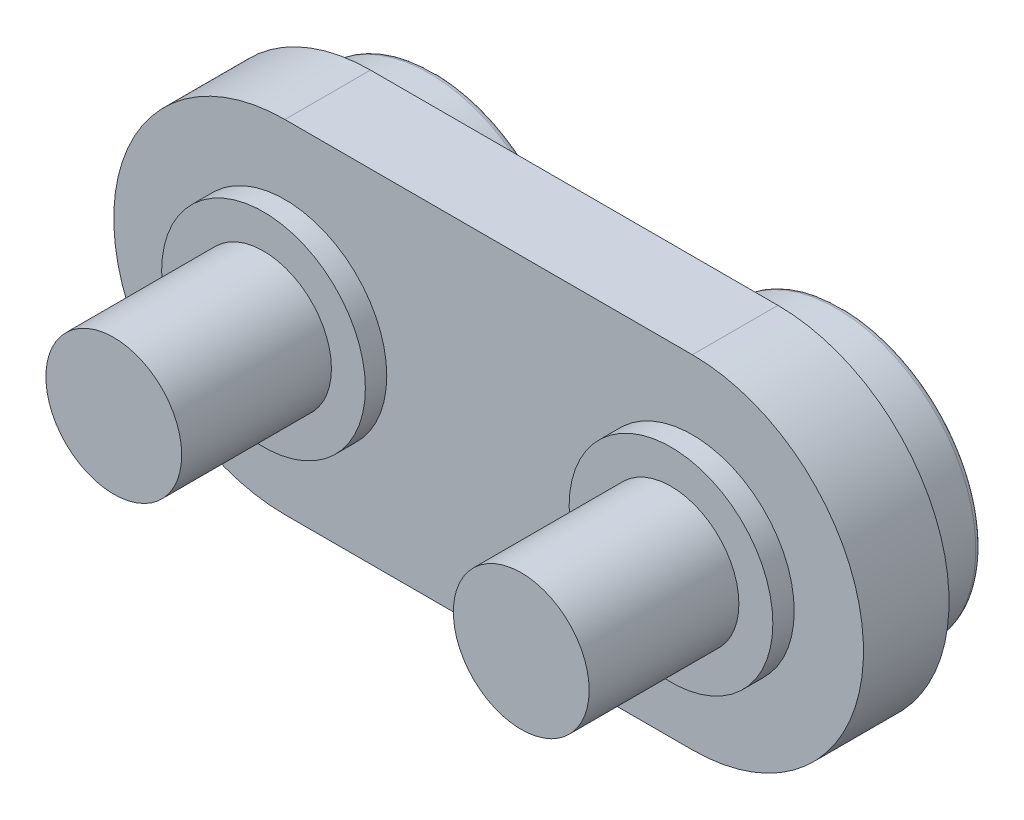
ISO-10303-21;
HEADER;
FILE_DESCRIPTION(('STEP AP214'),'2;1');
FILE_NAME('part.step','',(''),(''),'','','');
FILE_SCHEMA(('AUTOMOTIVE_DESIGN { 1 0 10303 214 1 1 1 1 }'));
ENDSEC;
DATA;
#1=APPLICATION_CONTEXT('core data for automotive mechanical design processes');
#2=APPLICATION_PROTOCOL_DEFINITION('international standard','automotive_design',2000,#1);
#3=PRODUCT_CONTEXT('',#1,'mechanical');
#4=PRODUCT('Part','Part','',(#3));
#5=PRODUCT_RELATED_PRODUCT_CATEGORY('part','',(#4));
#6=PRODUCT_DEFINITION_FORMATION('','',#4);
#7=PRODUCT_DEFINITION_CONTEXT('part definition',#1,'design');
#8=PRODUCT_DEFINITION('design','',#6,#7);
#9=PRODUCT_DEFINITION_SHAPE('','',#8);
#10=(LENGTH_UNIT() NAMED_UNIT(*) SI_UNIT(.MILLI.,.METRE.));
#11=(NAMED_UNIT(*) PLANE_ANGLE_UNIT() SI_UNIT($,.RADIAN.));
#12=(NAMED_UNIT(*) SI_UNIT($,.STERADIAN.) SOLID_ANGLE_UNIT());
#13=UNCERTAINTY_MEASURE_WITH_UNIT(LENGTH_MEASURE(1.E-05),#10,'distance_accuracy_value','');
#14=(GEOMETRIC_REPRESENTATION_CONTEXT(3) GLOBAL_UNCERTAINTY_ASSIGNED_CONTEXT((#13)) GLOBAL_UNIT_ASSIGNED_CONTEXT((#10,
#11,#12)) REPRESENTATION_CONTEXT('',''));
#15=CARTESIAN_POINT('',(0.,0.,0.));
#16=DIRECTION('',(0.,0.,1.));
#17=DIRECTION('',(1.,0.,0.));
#18=AXIS2_PLACEMENT_3D('',#15,#16,#17);
#19=CARTESIAN_POINT('',(9.525,0.,12.));
#20=DIRECTION('',(0.,0.,-1.));
#21=DIRECTION('',(-1.,0.,0.));
#22=AXIS2_PLACEMENT_3D('',#19,#20,#21);
#23=CYLINDRICAL_SURFACE('',#22,3.175);
#24=CARTESIAN_POINT('',(9.525,0.,12.));
#25=DIRECTION('',(0.,0.,1.));
#26=DIRECTION('',(1.,0.,0.));
#27=AXIS2_PLACEMENT_3D('',#24,#25,#26);
#28=CIRCLE('',#27,3.175);
#29=CARTESIAN_POINT('',(12.7,0.,12.));
#30=VERTEX_POINT('',#29);
#31=EDGE_CURVE('E11',#30,#30,#28,.T.);
#32=ORIENTED_EDGE('',*,*,#31,.F.);
#33=EDGE_LOOP('',(#32));
#34=FACE_BOUND('',#33,.T.);
#35=CARTESIAN_POINT('',(9.525,0.,5.));
#36=DIRECTION('',(0.,0.,1.));
#37=DIRECTION('',(1.,0.,0.));
#38=AXIS2_PLACEMENT_3D('',#35,#36,#37);
#39=CIRCLE('',#38,3.175);
#40=CARTESIAN_POINT('',(12.7,0.,5.));
#41=VERTEX_POINT('',#40);
#42=EDGE_CURVE('E46',#41,#41,#39,.T.);
#43=ORIENTED_EDGE('',*,*,#42,.T.);
#44=EDGE_LOOP('',(#43));
#45=FACE_BOUND('',#44,.T.);
#46=ADVANCED_FACE('F43',(#34,#45),#23,.T.);
#47=CARTESIAN_POINT('',(9.525,0.,12.));
#48=DIRECTION('',(0.,0.,1.));
#49=DIRECTION('',(1.,0.,0.));
#50=AXIS2_PLACEMENT_3D('',#47,#48,#49);
#51=PLANE('',#50);
#52=ORIENTED_EDGE('',*,*,#31,.T.);
#53=EDGE_LOOP('',(#52));
#54=FACE_BOUND('',#53,.T.);
#55=ADVANCED_FACE('F58',(#54),#51,.T.);
#56=CARTESIAN_POINT('',(9.525,0.,5.));
#57=DIRECTION('',(0.,0.,1.));
#58=DIRECTION('',(1.,0.,0.));
#59=AXIS2_PLACEMENT_3D('',#56,#57,#58);
#60=PLANE('',#59);
#61=ORIENTED_EDGE('',*,*,#42,.F.);
#62=EDGE_LOOP('',(#61));
#63=FACE_BOUND('',#62,.T.);
#64=ADVANCED_FACE('F56',(#63),#60,.F.);
#65=CLOSED_SHELL('',(#46,#55,#64));
#66=MANIFOLD_SOLID_BREP('B2',#65);
#67=CARTESIAN_POINT('',(-9.525,0.,12.));
#68=DIRECTION('',(0.,0.,-1.));
#69=DIRECTION('',(-1.,0.,0.));
#70=AXIS2_PLACEMENT_3D('',#67,#68,#69);
#71=CYLINDRICAL_SURFACE('',#70,3.175);
#72=CARTESIAN_POINT('',(-9.525,0.,12.));
#73=DIRECTION('',(0.,0.,1.));
#74=DIRECTION('',(1.,0.,0.));
#75=AXIS2_PLACEMENT_3D('',#72,#73,#74);
#76=CIRCLE('',#75,3.175);
#77=CARTESIAN_POINT('',(-6.35,0.,12.));
#78=VERTEX_POINT('',#77);
#79=EDGE_CURVE('E42',#78,#78,#76,.T.);
#80=ORIENTED_EDGE('',*,*,#79,.F.);
#81=EDGE_LOOP('',(#80));
#82=FACE_BOUND('',#81,.T.);
#83=CARTESIAN_POINT('',(-9.525,0.,5.));
#84=DIRECTION('',(0.,0.,1.));
#85=DIRECTION('',(1.,0.,0.));
#86=AXIS2_PLACEMENT_3D('',#83,#84,#85);
#87=CIRCLE('',#86,3.175);
#88=CARTESIAN_POINT('',(-6.35,0.,5.));
#89=VERTEX_POINT('',#88);
#90=EDGE_CURVE('E94',#89,#89,#87,.T.);
#91=ORIENTED_EDGE('',*,*,#90,.T.);
#92=EDGE_LOOP('',(#91));
#93=FACE_BOUND('',#92,.T.);
#94=ADVANCED_FACE('F91',(#82,#93),#71,.T.);
#95=CARTESIAN_POINT('',(-9.525,0.,12.));
#96=DIRECTION('',(0.,0.,1.));
#97=DIRECTION('',(1.,0.,0.));
#98=AXIS2_PLACEMENT_3D('',#95,#96,#97);
#99=PLANE('',#98);
#100=ORIENTED_EDGE('',*,*,#79,.T.);
#101=EDGE_LOOP('',(#100));
#102=FACE_BOUND('',#101,.T.);
#103=ADVANCED_FACE('F106',(#102),#99,.T.);
#104=CARTESIAN_POINT('',(-9.525,0.,5.));
#105=DIRECTION('',(0.,0.,1.));
#106=DIRECTION('',(1.,0.,0.));
#107=AXIS2_PLACEMENT_3D('',#104,#105,#106);
#108=PLANE('',#107);
#109=ORIENTED_EDGE('',*,*,#90,.F.);
#110=EDGE_LOOP('',(#109));
#111=FACE_BOUND('',#110,.T.);
#112=ADVANCED_FACE('F104',(#111),#108,.F.);
#113=CLOSED_SHELL('',(#94,#103,#112));
#114=MANIFOLD_SOLID_BREP('B6',#113);
#115=CARTESIAN_POINT('',(9.525,0.,5.));
#116=DIRECTION('',(0.,0.,1.));
#117=DIRECTION('',(1.,0.,0.));
#118=AXIS2_PLACEMENT_3D('',#115,#116,#117);
#119=PLANE('',#118);
#120=CARTESIAN_POINT('',(9.525,0.,5.));
#121=DIRECTION('',(0.,0.,1.));
#122=DIRECTION('',(1.,0.,0.));
#123=AXIS2_PLACEMENT_3D('',#120,#121,#122);
#124=CIRCLE('',#123,4.7625);
#125=CARTESIAN_POINT('',(14.2875,0.,5.));
#126=VERTEX_POINT('',#125);
#127=EDGE_CURVE('E90',#126,#126,#124,.T.);
#128=ORIENTED_EDGE('',*,*,#127,.T.);
#129=EDGE_LOOP('',(#128));
#130=FACE_BOUND('',#129,.T.);
#131=CARTESIAN_POINT('',(9.525,0.,5.));
#132=DIRECTION('',(0.,0.,1.));
#133=DIRECTION('',(1.,0.,0.));
#134=AXIS2_PLACEMENT_3D('',#131,#132,#133);
#135=CIRCLE('',#134,2.11);
#136=CARTESIAN_POINT('',(11.635,0.,5.));
#137=VERTEX_POINT('',#136);
#138=EDGE_CURVE('E150',#137,#137,#135,.T.);
#139=ORIENTED_EDGE('',*,*,#138,.F.);
#140=EDGE_LOOP('',(#139));
#141=FACE_BOUND('',#140,.T.);
#142=ADVANCED_FACE('F139',(#130,#141),#119,.T.);
#143=CARTESIAN_POINT('',(9.525,0.,4.));
#144=DIRECTION('',(0.,0.,1.));
#145=DIRECTION('',(1.,0.,0.));
#146=AXIS2_PLACEMENT_3D('',#143,#144,#145);
#147=PLANE('',#146);
#148=CARTESIAN_POINT('',(9.525,0.,4.));
#149=DIRECTION('',(0.,0.,1.));
#150=DIRECTION('',(1.,0.,0.));
#151=AXIS2_PLACEMENT_3D('',#148,#149,#150);
#152=CIRCLE('',#151,4.7625);
#153=CARTESIAN_POINT('',(14.2875,0.,4.));
#154=VERTEX_POINT('',#153);
#155=EDGE_CURVE('E143',#154,#154,#152,.T.);
#156=ORIENTED_EDGE('',*,*,#155,.F.);
#157=EDGE_LOOP('',(#156));
#158=FACE_BOUND('',#157,.T.);
#159=CARTESIAN_POINT('',(9.525,0.,4.));
#160=DIRECTION('',(0.,0.,1.));
#161=DIRECTION('',(1.,0.,0.));
#162=AXIS2_PLACEMENT_3D('',#159,#160,#161);
#163=CIRCLE('',#162,2.11);
#164=CARTESIAN_POINT('',(11.635,0.,4.));
#165=VERTEX_POINT('',#164);
#166=EDGE_CURVE('E152',#165,#165,#163,.T.);
#167=ORIENTED_EDGE('',*,*,#166,.T.);
#168=EDGE_LOOP('',(#167));
#169=FACE_BOUND('',#168,.T.);
#170=ADVANCED_FACE('F162',(#158,#169),#147,.F.);
#171=CARTESIAN_POINT('',(9.525,0.,5.));
#172=DIRECTION('',(0.,0.,-1.));
#173=DIRECTION('',(-1.,0.,0.));
#174=AXIS2_PLACEMENT_3D('',#171,#172,#173);
#175=CYLINDRICAL_SURFACE('',#174,4.7625);
#176=ORIENTED_EDGE('',*,*,#127,.F.);
#177=EDGE_LOOP('',(#176));
#178=FACE_BOUND('',#177,.T.);
#179=ORIENTED_EDGE('',*,*,#155,.T.);
#180=EDGE_LOOP('',(#179));
#181=FACE_BOUND('',#180,.T.);
#182=ADVANCED_FACE('F141',(#178,#181),#175,.T.);
#183=CARTESIAN_POINT('',(9.525,0.,5.));
#184=DIRECTION('',(0.,0.,-1.));
#185=DIRECTION('',(-1.,0.,0.));
#186=AXIS2_PLACEMENT_3D('',#183,#184,#185);
#187=CYLINDRICAL_SURFACE('',#186,2.11);
#188=ORIENTED_EDGE('',*,*,#138,.T.);
#189=EDGE_LOOP('',(#188));
#190=FACE_BOUND('',#189,.T.);
#191=ORIENTED_EDGE('',*,*,#166,.F.);
#192=EDGE_LOOP('',(#191));
#193=FACE_BOUND('',#192,.T.);
#194=ADVANCED_FACE('F158',(#190,#193),#187,.F.);
#195=CLOSED_SHELL('',(#142,#170,#182,#194));
#196=MANIFOLD_SOLID_BREP('B37',#195);
#197=CARTESIAN_POINT('',(-9.525,0.,5.));
#198=DIRECTION('',(0.,0.,1.));
#199=DIRECTION('',(1.,0.,0.));
#200=AXIS2_PLACEMENT_3D('',#197,#198,#199);
#201=PLANE('',#200);
#202=CARTESIAN_POINT('',(-9.525,0.,5.));
#203=DIRECTION('',(0.,0.,1.));
#204=DIRECTION('',(1.,0.,0.));
#205=AXIS2_PLACEMENT_3D('',#202,#203,#204);
#206=CIRCLE('',#205,4.7625);
#207=CARTESIAN_POINT('',(-4.7625,0.,5.));
#208=VERTEX_POINT('',#207);
#209=EDGE_CURVE('E138',#208,#208,#206,.T.);
#210=ORIENTED_EDGE('',*,*,#209,.T.);
#211=EDGE_LOOP('',(#210));
#212=FACE_BOUND('',#211,.T.);
#213=CARTESIAN_POINT('',(-9.525,0.,5.));
#214=DIRECTION('',(0.,0.,1.));
#215=DIRECTION('',(1.,0.,0.));
#216=AXIS2_PLACEMENT_3D('',#213,#214,#215);
#217=CIRCLE('',#216,2.11);
#218=CARTESIAN_POINT('',(-7.415,0.,5.));
#219=VERTEX_POINT('',#218);
#220=EDGE_CURVE('E219',#219,#219,#217,.T.);
#221=ORIENTED_EDGE('',*,*,#220,.F.);
#222=EDGE_LOOP('',(#221));
#223=FACE_BOUND('',#222,.T.);
#224=ADVANCED_FACE('F208',(#212,#223),#201,.T.);
#225=CARTESIAN_POINT('',(-9.525,0.,4.));
#226=DIRECTION('',(0.,0.,1.));
#227=DIRECTION('',(1.,0.,0.));
#228=AXIS2_PLACEMENT_3D('',#225,#226,#227);
#229=PLANE('',#228);
#230=CARTESIAN_POINT('',(-9.525,0.,4.));
#231=DIRECTION('',(0.,0.,1.));
#232=DIRECTION('',(1.,0.,0.));
#233=AXIS2_PLACEMENT_3D('',#230,#231,#232);
#234=CIRCLE('',#233,4.7625);
#235=CARTESIAN_POINT('',(-4.7625,0.,4.));
#236=VERTEX_POINT('',#235);
#237=EDGE_CURVE('E212',#236,#236,#234,.T.);
#238=ORIENTED_EDGE('',*,*,#237,.F.);
#239=EDGE_LOOP('',(#238));
#240=FACE_BOUND('',#239,.T.);
#241=CARTESIAN_POINT('',(-9.525,0.,4.));
#242=DIRECTION('',(0.,0.,1.));
#243=DIRECTION('',(1.,0.,0.));
#244=AXIS2_PLACEMENT_3D('',#241,#242,#243);
#245=CIRCLE('',#244,2.11);
#246=CARTESIAN_POINT('',(-7.415,0.,4.));
#247=VERTEX_POINT('',#246);
#248=EDGE_CURVE('E221',#247,#247,#245,.T.);
#249=ORIENTED_EDGE('',*,*,#248,.T.);
#250=EDGE_LOOP('',(#249));
#251=FACE_BOUND('',#250,.T.);
#252=ADVANCED_FACE('F231',(#240,#251),#229,.F.);
#253=CARTESIAN_POINT('',(-9.525,0.,5.));
#254=DIRECTION('',(0.,0.,-1.));
#255=DIRECTION('',(-1.,0.,0.));
#256=AXIS2_PLACEMENT_3D('',#253,#254,#255);
#257=CYLINDRICAL_SURFACE('',#256,4.7625);
#258=ORIENTED_EDGE('',*,*,#209,.F.);
#259=EDGE_LOOP('',(#258));
#260=FACE_BOUND('',#259,.T.);
#261=ORIENTED_EDGE('',*,*,#237,.T.);
#262=EDGE_LOOP('',(#261));
#263=FACE_BOUND('',#262,.T.);
#264=ADVANCED_FACE('F210',(#260,#263),#257,.T.);
#265=CARTESIAN_POINT('',(-9.525,0.,5.));
#266=DIRECTION('',(0.,0.,-1.));
#267=DIRECTION('',(-1.,0.,0.));
#268=AXIS2_PLACEMENT_3D('',#265,#266,#267);
#269=CYLINDRICAL_SURFACE('',#268,2.11);
#270=ORIENTED_EDGE('',*,*,#220,.T.);
#271=EDGE_LOOP('',(#270));
#272=FACE_BOUND('',#271,.T.);
#273=ORIENTED_EDGE('',*,*,#248,.F.);
#274=EDGE_LOOP('',(#273));
#275=FACE_BOUND('',#274,.T.);
#276=ADVANCED_FACE('F227',(#272,#275),#269,.F.);
#277=CLOSED_SHELL('',(#224,#252,#264,#276));
#278=MANIFOLD_SOLID_BREP('B85',#277);
#279=CARTESIAN_POINT('',(-9.525,0.,-3.));
#280=DIRECTION('',(0.,0.,-1.));
#281=DIRECTION('',(-1.,0.,0.));
#282=AXIS2_PLACEMENT_3D('',#279,#280,#281);
#283=PLANE('',#282);
#284=CARTESIAN_POINT('',(-9.525,0.,-3.));
#285=DIRECTION('',(0.,0.,-1.));
#286=DIRECTION('',(-1.,0.,0.));
#287=AXIS2_PLACEMENT_3D('',#284,#285,#286);
#288=CIRCLE('',#287,3.11000000000001);
#289=CARTESIAN_POINT('',(-12.635,0.,-3.));
#290=VERTEX_POINT('',#289);
#291=EDGE_CURVE('E207',#290,#290,#288,.F.);
#292=ORIENTED_EDGE('',*,*,#291,.T.);
#293=EDGE_LOOP('',(#292));
#294=FACE_BOUND('',#293,.T.);
#295=CARTESIAN_POINT('',(-9.525,0.,-3.));
#296=DIRECTION('',(0.,0.,-1.));
#297=DIRECTION('',(-1.,0.,0.));
#298=AXIS2_PLACEMENT_3D('',#295,#296,#297);
#299=CIRCLE('',#298,6.25);
#300=CARTESIAN_POINT('',(-15.775,0.,-3.));
#301=VERTEX_POINT('',#300);
#302=EDGE_CURVE('E292',#301,#301,#299,.T.);
#303=ORIENTED_EDGE('',*,*,#302,.T.);
#304=EDGE_LOOP('',(#303));
#305=FACE_BOUND('',#304,.T.);
#306=ADVANCED_FACE('F277',(#294,#305),#283,.T.);
#307=CARTESIAN_POINT('',(-9.525,0.,0.));
#308=DIRECTION('',(0.,0.,-1.));
#309=DIRECTION('',(-1.,0.,0.));
#310=AXIS2_PLACEMENT_3D('',#307,#308,#309);
#311=PLANE('',#310);
#312=CARTESIAN_POINT('',(-9.525,0.,0.));
#313=DIRECTION('',(0.,0.,-1.));
#314=DIRECTION('',(-1.,0.,0.));
#315=AXIS2_PLACEMENT_3D('',#312,#313,#314);
#316=CIRCLE('',#315,6.5);
#317=CARTESIAN_POINT('',(-16.025,0.,0.));
#318=VERTEX_POINT('',#317);
#319=EDGE_CURVE('E297',#318,#318,#316,.T.);
#320=ORIENTED_EDGE('',*,*,#319,.F.);
#321=EDGE_LOOP('',(#320));
#322=FACE_BOUND('',#321,.T.);
#323=CARTESIAN_POINT('',(-9.525,0.,0.));
#324=DIRECTION('',(0.,0.,-1.));
#325=DIRECTION('',(-1.,0.,0.));
#326=AXIS2_PLACEMENT_3D('',#323,#324,#325);
#327=CIRCLE('',#326,2.11);
#328=CARTESIAN_POINT('',(-11.635,0.,0.));
#329=VERTEX_POINT('',#328);
#330=EDGE_CURVE('E300',#329,#329,#327,.T.);
#331=ORIENTED_EDGE('',*,*,#330,.T.);
#332=EDGE_LOOP('',(#331));
#333=FACE_BOUND('',#332,.T.);
#334=ADVANCED_FACE('F304',(#322,#333),#311,.F.);
#335=CARTESIAN_POINT('',(-9.525,0.,-3.));
#336=DIRECTION('',(0.,0.,1.));
#337=DIRECTION('',(1.,0.,0.));
#338=AXIS2_PLACEMENT_3D('',#335,#336,#337);
#339=CYLINDRICAL_SURFACE('',#338,6.5);
#340=CARTESIAN_POINT('',(-9.525,0.,-2.75));
#341=DIRECTION('',(0.,0.,-1.));
#342=DIRECTION('',(-1.,0.,0.));
#343=AXIS2_PLACEMENT_3D('',#340,#341,#342);
#344=CIRCLE('',#343,6.5);
#345=CARTESIAN_POINT('',(-16.025,0.,-2.75));
#346=VERTEX_POINT('',#345);
#347=EDGE_CURVE('E288',#346,#346,#344,.F.);
#348=ORIENTED_EDGE('',*,*,#347,.T.);
#349=EDGE_LOOP('',(#348));
#350=FACE_BOUND('',#349,.T.);
#351=ORIENTED_EDGE('',*,*,#319,.T.);
#352=EDGE_LOOP('',(#351));
#353=FACE_BOUND('',#352,.T.);
#354=ADVANCED_FACE('F309',(#350,#353),#339,.T.);
#355=CARTESIAN_POINT('',(-9.525,0.,-3.));
#356=DIRECTION('',(0.,0.,1.));
#357=DIRECTION('',(1.,0.,0.));
#358=AXIS2_PLACEMENT_3D('',#355,#356,#357);
#359=CYLINDRICAL_SURFACE('',#358,2.11);
#360=CARTESIAN_POINT('',(-9.525,0.,-2.42264973081038));
#361=DIRECTION('',(0.,0.,-1.));
#362=DIRECTION('',(-1.,0.,0.));
#363=AXIS2_PLACEMENT_3D('',#360,#361,#362);
#364=CIRCLE('',#363,2.11);
#365=CARTESIAN_POINT('',(-11.635,0.,-2.42264973081038));
#366=VERTEX_POINT('',#365);
#367=EDGE_CURVE('E284',#366,#366,#364,.T.);
#368=ORIENTED_EDGE('',*,*,#367,.T.);
#369=EDGE_LOOP('',(#368));
#370=FACE_BOUND('',#369,.T.);
#371=ORIENTED_EDGE('',*,*,#330,.F.);
#372=EDGE_LOOP('',(#371));
#373=FACE_BOUND('',#372,.T.);
#374=ADVANCED_FACE('F306',(#370,#373),#359,.F.);
#375=CARTESIAN_POINT('',(-9.525,0.,-2.75));
#376=DIRECTION('',(0.,0.,-1.));
#377=DIRECTION('',(-1.,0.,0.));
#378=AXIS2_PLACEMENT_3D('',#375,#376,#377);
#379=TOROIDAL_SURFACE('',#378,6.25,0.25);
#380=ORIENTED_EDGE('',*,*,#347,.F.);
#381=EDGE_LOOP('',(#380));
#382=FACE_BOUND('',#381,.T.);
#383=ORIENTED_EDGE('',*,*,#302,.F.);
#384=EDGE_LOOP('',(#383));
#385=FACE_BOUND('',#384,.T.);
#386=ADVANCED_FACE('F308',(#382,#385),#379,.T.);
#387=CARTESIAN_POINT('',(-9.525,0.,-2.42264973081038));
#388=DIRECTION('',(0.,0.,-1.));
#389=DIRECTION('',(-1.,0.,0.));
#390=AXIS2_PLACEMENT_3D('',#387,#388,#389);
#391=CONICAL_SURFACE('',#390,2.11,1.0471975511966);
#392=ORIENTED_EDGE('',*,*,#291,.F.);
#393=EDGE_LOOP('',(#392));
#394=FACE_BOUND('',#393,.T.);
#395=ORIENTED_EDGE('',*,*,#367,.F.);
#396=EDGE_LOOP('',(#395));
#397=FACE_BOUND('',#396,.T.);
#398=ADVANCED_FACE('F279',(#394,#397),#391,.F.);
#399=CLOSED_SHELL('',(#306,#334,#354,#374,#386,#398));
#400=MANIFOLD_SOLID_BREP('B133',#399);
#401=CARTESIAN_POINT('',(9.525,0.,-3.));
#402=DIRECTION('',(0.,0.,-1.));
#403=DIRECTION('',(-1.,0.,0.));
#404=AXIS2_PLACEMENT_3D('',#401,#402,#403);
#405=PLANE('',#404);
#406=CARTESIAN_POINT('',(9.525,0.,-3.));
#407=DIRECTION('',(0.,0.,-1.));
#408=DIRECTION('',(-1.,0.,0.));
#409=AXIS2_PLACEMENT_3D('',#406,#407,#408);
#410=CIRCLE('',#409,3.11000000000001);
#411=CARTESIAN_POINT('',(6.41499999999999,0.,-3.));
#412=VERTEX_POINT('',#411);
#413=EDGE_CURVE('E276',#412,#412,#410,.F.);
#414=ORIENTED_EDGE('',*,*,#413,.T.);
#415=EDGE_LOOP('',(#414));
#416=FACE_BOUND('',#415,.T.);
#417=CARTESIAN_POINT('',(9.525,0.,-3.));
#418=DIRECTION('',(0.,0.,-1.));
#419=DIRECTION('',(-1.,0.,0.));
#420=AXIS2_PLACEMENT_3D('',#417,#418,#419);
#421=CIRCLE('',#420,6.25);
#422=CARTESIAN_POINT('',(3.275,0.,-3.));
#423=VERTEX_POINT('',#422);
#424=EDGE_CURVE('E392',#423,#423,#421,.T.);
#425=ORIENTED_EDGE('',*,*,#424,.T.);
#426=EDGE_LOOP('',(#425));
#427=FACE_BOUND('',#426,.T.);
#428=ADVANCED_FACE('F377',(#416,#427),#405,.T.);
#429=CARTESIAN_POINT('',(9.525,0.,0.));
#430=DIRECTION('',(0.,0.,-1.));
#431=DIRECTION('',(-1.,0.,0.));
#432=AXIS2_PLACEMENT_3D('',#429,#430,#431);
#433=PLANE('',#432);
#434=CARTESIAN_POINT('',(9.525,0.,0.));
#435=DIRECTION('',(0.,0.,-1.));
#436=DIRECTION('',(-1.,0.,0.));
#437=AXIS2_PLACEMENT_3D('',#434,#435,#436);
#438=CIRCLE('',#437,6.5);
#439=CARTESIAN_POINT('',(3.02499999999999,0.,0.));
#440=VERTEX_POINT('',#439);
#441=EDGE_CURVE('E397',#440,#440,#438,.T.);
#442=ORIENTED_EDGE('',*,*,#441,.F.);
#443=EDGE_LOOP('',(#442));
#444=FACE_BOUND('',#443,.T.);
#445=CARTESIAN_POINT('',(9.525,0.,0.));
#446=DIRECTION('',(0.,0.,-1.));
#447=DIRECTION('',(-1.,0.,0.));
#448=AXIS2_PLACEMENT_3D('',#445,#446,#447);
#449=CIRCLE('',#448,2.11);
#450=CARTESIAN_POINT('',(7.41499999999999,0.,0.));
#451=VERTEX_POINT('',#450);
#452=EDGE_CURVE('E400',#451,#451,#449,.T.);
#453=ORIENTED_EDGE('',*,*,#452,.T.);
#454=EDGE_LOOP('',(#453));
#455=FACE_BOUND('',#454,.T.);
#456=ADVANCED_FACE('F404',(#444,#455),#433,.F.);
#457=CARTESIAN_POINT('',(9.525,0.,-3.));
#458=DIRECTION('',(0.,0.,1.));
#459=DIRECTION('',(1.,0.,0.));
#460=AXIS2_PLACEMENT_3D('',#457,#458,#459);
#461=CYLINDRICAL_SURFACE('',#460,6.5);
#462=CARTESIAN_POINT('',(9.525,0.,-2.75));
#463=DIRECTION('',(0.,0.,-1.));
#464=DIRECTION('',(-1.,0.,0.));
#465=AXIS2_PLACEMENT_3D('',#462,#463,#464);
#466=CIRCLE('',#465,6.5);
#467=CARTESIAN_POINT('',(3.02499999999999,0.,-2.75));
#468=VERTEX_POINT('',#467);
#469=EDGE_CURVE('E388',#468,#468,#466,.F.);
#470=ORIENTED_EDGE('',*,*,#469,.T.);
#471=EDGE_LOOP('',(#470));
#472=FACE_BOUND('',#471,.T.);
#473=ORIENTED_EDGE('',*,*,#441,.T.);
#474=EDGE_LOOP('',(#473));
#475=FACE_BOUND('',#474,.T.);
#476=ADVANCED_FACE('F409',(#472,#475),#461,.T.);
#477=CARTESIAN_POINT('',(9.525,0.,-3.));
#478=DIRECTION('',(0.,0.,1.));
#479=DIRECTION('',(1.,0.,0.));
#480=AXIS2_PLACEMENT_3D('',#477,#478,#479);
#481=CYLINDRICAL_SURFACE('',#480,2.11);
#482=CARTESIAN_POINT('',(9.525,0.,-2.42264973081038));
#483=DIRECTION('',(0.,0.,-1.));
#484=DIRECTION('',(-1.,0.,0.));
#485=AXIS2_PLACEMENT_3D('',#482,#483,#484);
#486=CIRCLE('',#485,2.11);
#487=CARTESIAN_POINT('',(7.41499999999999,0.,-2.42264973081038));
#488=VERTEX_POINT('',#487);
#489=EDGE_CURVE('E384',#488,#488,#486,.T.);
#490=ORIENTED_EDGE('',*,*,#489,.T.);
#491=EDGE_LOOP('',(#490));
#492=FACE_BOUND('',#491,.T.);
#493=ORIENTED_EDGE('',*,*,#452,.F.);
#494=EDGE_LOOP('',(#493));
#495=FACE_BOUND('',#494,.T.);
#496=ADVANCED_FACE('F406',(#492,#495),#481,.F.);
#497=CARTESIAN_POINT('',(9.525,0.,-2.75));
#498=DIRECTION('',(0.,0.,-1.));
#499=DIRECTION('',(-1.,0.,0.));
#500=AXIS2_PLACEMENT_3D('',#497,#498,#499);
#501=TOROIDAL_SURFACE('',#500,6.25,0.25);
#502=ORIENTED_EDGE('',*,*,#469,.F.);
#503=EDGE_LOOP('',(#502));
#504=FACE_BOUND('',#503,.T.);
#505=ORIENTED_EDGE('',*,*,#424,.F.);
#506=EDGE_LOOP('',(#505));
#507=FACE_BOUND('',#506,.T.);
#508=ADVANCED_FACE('F408',(#504,#507),#501,.T.);
#509=CARTESIAN_POINT('',(9.525,0.,-2.42264973081038));
#510=DIRECTION('',(0.,0.,-1.));
#511=DIRECTION('',(-1.,0.,0.));
#512=AXIS2_PLACEMENT_3D('',#509,#510,#511);
#513=CONICAL_SURFACE('',#512,2.11,1.0471975511966);
#514=ORIENTED_EDGE('',*,*,#413,.F.);
#515=EDGE_LOOP('',(#514));
#516=FACE_BOUND('',#515,.T.);
#517=ORIENTED_EDGE('',*,*,#489,.F.);
#518=EDGE_LOOP('',(#517));
#519=FACE_BOUND('',#518,.T.);
#520=ADVANCED_FACE('F379',(#516,#519),#513,.F.);
#521=CLOSED_SHELL('',(#428,#456,#476,#496,#508,#520));
#522=MANIFOLD_SOLID_BREP('B202',#521);
#523=CARTESIAN_POINT('',(9.525,0.,4.));
#524=DIRECTION('',(0.,0.,-1.));
#525=DIRECTION('',(-1.,0.,0.));
#526=AXIS2_PLACEMENT_3D('',#523,#524,#525);
#527=PLANE('',#526);
#528=CARTESIAN_POINT('',(9.525,0.,4.));
#529=DIRECTION('',(0.,0.,1.));
#530=DIRECTION('',(-1.,0.,0.));
#531=AXIS2_PLACEMENT_3D('',#528,#529,#530);
#532=CIRCLE('',#531,8.);
#533=CARTESIAN_POINT('',(9.525,-8.,4.));
#534=VERTEX_POINT('',#533);
#535=CARTESIAN_POINT('',(9.525,8.,4.));
#536=VERTEX_POINT('',#535);
#537=EDGE_CURVE('E520',#534,#536,#532,.T.);
#538=ORIENTED_EDGE('',*,*,#537,.T.);
#539=DIRECTION('',(-1.,0.,0.));
#540=VECTOR('',#539,1.);
#541=CARTESIAN_POINT('',(-9.525,8.,4.));
#542=LINE('',#541,#540);
#543=CARTESIAN_POINT('',(-9.525,8.,4.));
#544=VERTEX_POINT('',#543);
#545=EDGE_CURVE('E515',#536,#544,#542,.T.);
#546=ORIENTED_EDGE('',*,*,#545,.T.);
#547=CARTESIAN_POINT('',(-9.525,0.,4.));
#548=DIRECTION('',(0.,0.,1.));
#549=DIRECTION('',(1.,0.,0.));
#550=AXIS2_PLACEMENT_3D('',#547,#548,#549);
#551=CIRCLE('',#550,8.);
#552=CARTESIAN_POINT('',(-9.525,-8.,4.));
#553=VERTEX_POINT('',#552);
#554=EDGE_CURVE('E518',#544,#553,#551,.T.);
#555=ORIENTED_EDGE('',*,*,#554,.T.);
#556=DIRECTION('',(1.,0.,0.));
#557=VECTOR('',#556,1.);
#558=CARTESIAN_POINT('',(-9.525,-8.,4.));
#559=LINE('',#558,#557);
#560=EDGE_CURVE('E485',#553,#534,#559,.T.);
#561=ORIENTED_EDGE('',*,*,#560,.T.);
#562=EDGE_LOOP('',(#538,#546,#555,#561));
#563=FACE_BOUND('',#562,.T.);
#564=CARTESIAN_POINT('',(-9.525,0.,4.));
#565=DIRECTION('',(0.,0.,1.));
#566=DIRECTION('',(1.,0.,0.));
#567=AXIS2_PLACEMENT_3D('',#564,#565,#566);
#568=CIRCLE('',#567,2.11);
#569=CARTESIAN_POINT('',(-7.415,0.,4.));
#570=VERTEX_POINT('',#569);
#571=EDGE_CURVE('E535',#570,#570,#568,.T.);
#572=ORIENTED_EDGE('',*,*,#571,.F.);
#573=EDGE_LOOP('',(#572));
#574=FACE_BOUND('',#573,.T.);
#575=CARTESIAN_POINT('',(9.525,0.,4.));
#576=DIRECTION('',(0.,0.,1.));
#577=DIRECTION('',(1.,0.,0.));
#578=AXIS2_PLACEMENT_3D('',#575,#576,#577);
#579=CIRCLE('',#578,2.11);
#580=CARTESIAN_POINT('',(11.635,0.,4.));
#581=VERTEX_POINT('',#580);
#582=EDGE_CURVE('E550',#581,#581,#579,.T.);
#583=ORIENTED_EDGE('',*,*,#582,.F.);
#584=EDGE_LOOP('',(#583));
#585=FACE_BOUND('',#584,.T.);
#586=ADVANCED_FACE('F468',(#563,#574,#585),#527,.F.);
#587=CARTESIAN_POINT('',(9.525,0.,0.));
#588=DIRECTION('',(0.,0.,-1.));
#589=DIRECTION('',(-1.,0.,0.));
#590=AXIS2_PLACEMENT_3D('',#587,#588,#589);
#591=PLANE('',#590);
#592=CARTESIAN_POINT('',(-9.525,0.,0.));
#593=DIRECTION('',(0.,0.,1.));
#594=DIRECTION('',(1.,0.,0.));
#595=AXIS2_PLACEMENT_3D('',#592,#593,#594);
#596=CIRCLE('',#595,2.11);
#597=CARTESIAN_POINT('',(-7.415,0.,0.));
#598=VERTEX_POINT('',#597);
#599=EDGE_CURVE('E547',#598,#598,#596,.T.);
#600=ORIENTED_EDGE('',*,*,#599,.T.);
#601=EDGE_LOOP('',(#600));
#602=FACE_BOUND('',#601,.T.);
#603=CARTESIAN_POINT('',(9.525,0.,0.));
#604=DIRECTION('',(0.,0.,1.));
#605=DIRECTION('',(-1.,0.,0.));
#606=AXIS2_PLACEMENT_3D('',#603,#604,#605);
#607=CIRCLE('',#606,8.);
#608=CARTESIAN_POINT('',(9.525,-8.,0.));
#609=VERTEX_POINT('',#608);
#610=CARTESIAN_POINT('',(9.525,8.,0.));
#611=VERTEX_POINT('',#610);
#612=EDGE_CURVE('E532',#609,#611,#607,.T.);
#613=ORIENTED_EDGE('',*,*,#612,.F.);
#614=DIRECTION('',(1.,0.,0.));
#615=VECTOR('',#614,1.);
#616=CARTESIAN_POINT('',(-9.525,-8.,0.));
#617=LINE('',#616,#615);
#618=CARTESIAN_POINT('',(-9.525,-8.,0.));
#619=VERTEX_POINT('',#618);
#620=EDGE_CURVE('E508',#619,#609,#617,.T.);
#621=ORIENTED_EDGE('',*,*,#620,.F.);
#622=CARTESIAN_POINT('',(-9.525,0.,0.));
#623=DIRECTION('',(0.,0.,1.));
#624=DIRECTION('',(1.,0.,0.));
#625=AXIS2_PLACEMENT_3D('',#622,#623,#624);
#626=CIRCLE('',#625,8.);
#627=CARTESIAN_POINT('',(-9.525,8.,0.));
#628=VERTEX_POINT('',#627);
#629=EDGE_CURVE('E502',#628,#619,#626,.T.);
#630=ORIENTED_EDGE('',*,*,#629,.F.);
#631=DIRECTION('',(-1.,0.,0.));
#632=VECTOR('',#631,1.);
#633=CARTESIAN_POINT('',(-9.525,8.,0.));
#634=LINE('',#633,#632);
#635=EDGE_CURVE('E524',#611,#628,#634,.T.);
#636=ORIENTED_EDGE('',*,*,#635,.F.);
#637=EDGE_LOOP('',(#613,#621,#630,#636));
#638=FACE_BOUND('',#637,.T.);
#639=CARTESIAN_POINT('',(9.525,0.,0.));
#640=DIRECTION('',(0.,0.,1.));
#641=DIRECTION('',(1.,0.,0.));
#642=AXIS2_PLACEMENT_3D('',#639,#640,#641);
#643=CIRCLE('',#642,2.11);
#644=CARTESIAN_POINT('',(11.635,0.,0.));
#645=VERTEX_POINT('',#644);
#646=EDGE_CURVE('E553',#645,#645,#643,.T.);
#647=ORIENTED_EDGE('',*,*,#646,.T.);
#648=EDGE_LOOP('',(#647));
#649=FACE_BOUND('',#648,.T.);
#650=ADVANCED_FACE('F543',(#602,#638,#649),#591,.T.);
#651=CARTESIAN_POINT('',(9.525,0.,4.));
#652=DIRECTION('',(0.,0.,-1.));
#653=DIRECTION('',(-1.,0.,0.));
#654=AXIS2_PLACEMENT_3D('',#651,#652,#653);
#655=CYLINDRICAL_SURFACE('',#654,8.);
#656=ORIENTED_EDGE('',*,*,#612,.T.);
#657=DIRECTION('',(0.,0.,-1.));
#658=VECTOR('',#657,1.);
#659=CARTESIAN_POINT('',(9.525,8.,4.));
#660=LINE('',#659,#658);
#661=EDGE_CURVE('E375',#536,#611,#660,.T.);
#662=ORIENTED_EDGE('',*,*,#661,.F.);
#663=ORIENTED_EDGE('',*,*,#537,.F.);
#664=DIRECTION('',(0.,0.,-1.));
#665=VECTOR('',#664,1.);
#666=CARTESIAN_POINT('',(9.525,-8.,4.));
#667=LINE('',#666,#665);
#668=EDGE_CURVE('E528',#534,#609,#667,.T.);
#669=ORIENTED_EDGE('',*,*,#668,.T.);
#670=EDGE_LOOP('',(#656,#662,#663,#669));
#671=FACE_BOUND('',#670,.T.);
#672=ADVANCED_FACE('F470',(#671),#655,.T.);
#673=CARTESIAN_POINT('',(-9.525,8.,4.));
#674=DIRECTION('',(0.,-1.,0.));
#675=DIRECTION('',(0.,0.,-1.));
#676=AXIS2_PLACEMENT_3D('',#673,#674,#675);
#677=PLANE('',#676);
#678=ORIENTED_EDGE('',*,*,#635,.T.);
#679=DIRECTION('',(0.,0.,-1.));
#680=VECTOR('',#679,1.);
#681=CARTESIAN_POINT('',(-9.525,8.,4.));
#682=LINE('',#681,#680);
#683=EDGE_CURVE('E477',#544,#628,#682,.T.);
#684=ORIENTED_EDGE('',*,*,#683,.F.);
#685=ORIENTED_EDGE('',*,*,#545,.F.);
#686=ORIENTED_EDGE('',*,*,#661,.T.);
#687=EDGE_LOOP('',(#678,#684,#685,#686));
#688=FACE_BOUND('',#687,.T.);
#689=ADVANCED_FACE('F523',(#688),#677,.F.);
#690=CARTESIAN_POINT('',(-9.525,0.,4.));
#691=DIRECTION('',(0.,0.,-1.));
#692=DIRECTION('',(-1.,0.,0.));
#693=AXIS2_PLACEMENT_3D('',#690,#691,#692);
#694=CYLINDRICAL_SURFACE('',#693,8.);
#695=ORIENTED_EDGE('',*,*,#629,.T.);
#696=DIRECTION('',(0.,0.,-1.));
#697=VECTOR('',#696,1.);
#698=CARTESIAN_POINT('',(-9.525,-8.,4.));
#699=LINE('',#698,#697);
#700=EDGE_CURVE('E525',#553,#619,#699,.T.);
#701=ORIENTED_EDGE('',*,*,#700,.F.);
#702=ORIENTED_EDGE('',*,*,#554,.F.);
#703=ORIENTED_EDGE('',*,*,#683,.T.);
#704=EDGE_LOOP('',(#695,#701,#702,#703));
#705=FACE_BOUND('',#704,.T.);
#706=ADVANCED_FACE('F526',(#705),#694,.T.);
#707=CARTESIAN_POINT('',(-9.525,-8.,4.));
#708=DIRECTION('',(0.,1.,0.));
#709=DIRECTION('',(0.,0.,1.));
#710=AXIS2_PLACEMENT_3D('',#707,#708,#709);
#711=PLANE('',#710);
#712=ORIENTED_EDGE('',*,*,#620,.T.);
#713=ORIENTED_EDGE('',*,*,#668,.F.);
#714=ORIENTED_EDGE('',*,*,#560,.F.);
#715=ORIENTED_EDGE('',*,*,#700,.T.);
#716=EDGE_LOOP('',(#712,#713,#714,#715));
#717=FACE_BOUND('',#716,.T.);
#718=ADVANCED_FACE('F540',(#717),#711,.F.);
#719=CARTESIAN_POINT('',(-9.525,0.,4.));
#720=DIRECTION('',(0.,0.,-1.));
#721=DIRECTION('',(-1.,0.,0.));
#722=AXIS2_PLACEMENT_3D('',#719,#720,#721);
#723=CYLINDRICAL_SURFACE('',#722,2.11);
#724=ORIENTED_EDGE('',*,*,#571,.T.);
#725=EDGE_LOOP('',(#724));
#726=FACE_BOUND('',#725,.T.);
#727=ORIENTED_EDGE('',*,*,#599,.F.);
#728=EDGE_LOOP('',(#727));
#729=FACE_BOUND('',#728,.T.);
#730=ADVANCED_FACE('F570',(#726,#729),#723,.F.);
#731=CARTESIAN_POINT('',(9.525,0.,4.));
#732=DIRECTION('',(0.,0.,-1.));
#733=DIRECTION('',(-1.,0.,0.));
#734=AXIS2_PLACEMENT_3D('',#731,#732,#733);
#735=CYLINDRICAL_SURFACE('',#734,2.11);
#736=ORIENTED_EDGE('',*,*,#582,.T.);
#737=EDGE_LOOP('',(#736));
#738=FACE_BOUND('',#737,.T.);
#739=ORIENTED_EDGE('',*,*,#646,.F.);
#740=EDGE_LOOP('',(#739));
#741=FACE_BOUND('',#740,.T.);
#742=ADVANCED_FACE('F559',(#738,#741),#735,.F.);
#743=CLOSED_SHELL('',(#586,#650,#672,#689,#706,#718,#730,#742));
#744=MANIFOLD_SOLID_BREP('B271',#743);
#745=ADVANCED_BREP_SHAPE_REPRESENTATION('',(#18,#66,#114,#196,#278,#400,#522,#744),#14);
#746=SHAPE_DEFINITION_REPRESENTATION(#9,#745);
ENDSEC;
END-ISO-10303-21;
